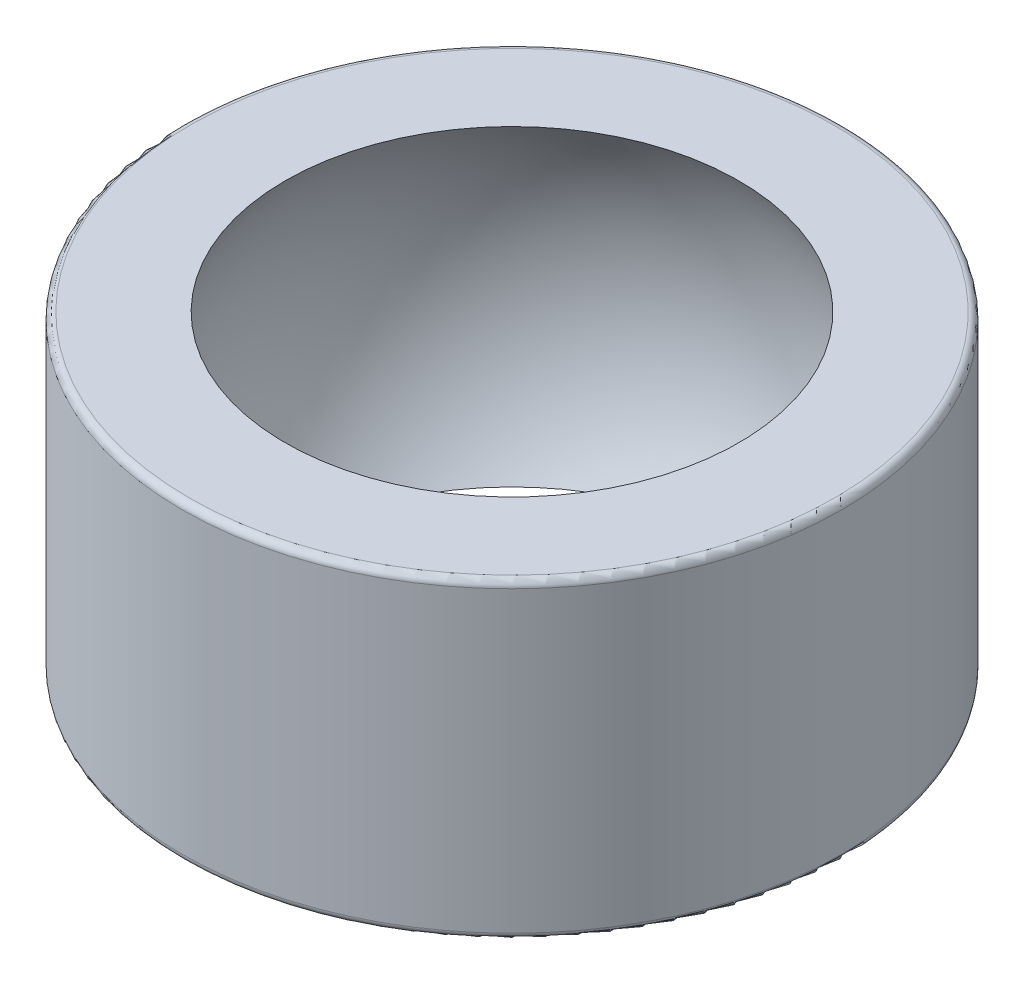
ISO-10303-21;
HEADER;
FILE_DESCRIPTION(('STEP AP214'),'2;1');
FILE_NAME('part.step','',(''),(''),'','','');
FILE_SCHEMA(('AUTOMOTIVE_DESIGN { 1 0 10303 214 1 1 1 1 }'));
ENDSEC;
DATA;
#1=APPLICATION_CONTEXT('core data for automotive mechanical design processes');
#2=APPLICATION_PROTOCOL_DEFINITION('international standard','automotive_design',2000,#1);
#3=PRODUCT_CONTEXT('',#1,'mechanical');
#4=PRODUCT('Part','Part','',(#3));
#5=PRODUCT_RELATED_PRODUCT_CATEGORY('part','',(#4));
#6=PRODUCT_DEFINITION_FORMATION('','',#4);
#7=PRODUCT_DEFINITION_CONTEXT('part definition',#1,'design');
#8=PRODUCT_DEFINITION('design','',#6,#7);
#9=PRODUCT_DEFINITION_SHAPE('','',#8);
#10=(LENGTH_UNIT() NAMED_UNIT(*) SI_UNIT(.MILLI.,.METRE.));
#11=(NAMED_UNIT(*) PLANE_ANGLE_UNIT() SI_UNIT($,.RADIAN.));
#12=(NAMED_UNIT(*) SI_UNIT($,.STERADIAN.) SOLID_ANGLE_UNIT());
#13=UNCERTAINTY_MEASURE_WITH_UNIT(LENGTH_MEASURE(1.E-05),#10,'distance_accuracy_value','');
#14=(GEOMETRIC_REPRESENTATION_CONTEXT(3) GLOBAL_UNCERTAINTY_ASSIGNED_CONTEXT((#13)) GLOBAL_UNIT_ASSIGNED_CONTEXT((#10,
#11,#12)) REPRESENTATION_CONTEXT('',''));
#15=CARTESIAN_POINT('',(0.,0.,0.));
#16=DIRECTION('',(0.,0.,1.));
#17=DIRECTION('',(1.,0.,0.));
#18=AXIS2_PLACEMENT_3D('',#15,#16,#17);
#19=CARTESIAN_POINT('',(0.,4.5,0.));
#20=DIRECTION('',(0.,-1.,0.));
#21=DIRECTION('',(0.,0.,-1.));
#22=AXIS2_PLACEMENT_3D('',#19,#20,#21);
#23=CYLINDRICAL_SURFACE('',#22,9.5);
#24=CARTESIAN_POINT('',(0.,-4.3,0.));
#25=DIRECTION('',(0.,1.,0.));
#26=DIRECTION('',(0.,0.,1.));
#27=AXIS2_PLACEMENT_3D('',#24,#25,#26);
#28=CIRCLE('',#27,9.5);
#29=CARTESIAN_POINT('',(0.,-4.3,9.5));
#30=VERTEX_POINT('',#29);
#31=EDGE_CURVE('E42',#30,#30,#28,.T.);
#32=ORIENTED_EDGE('',*,*,#31,.T.);
#33=EDGE_LOOP('',(#32));
#34=FACE_BOUND('',#33,.T.);
#35=CARTESIAN_POINT('',(0.,4.3,0.));
#36=DIRECTION('',(0.,1.,0.));
#37=DIRECTION('',(0.,0.,1.));
#38=AXIS2_PLACEMENT_3D('',#35,#36,#37);
#39=CIRCLE('',#38,9.5);
#40=CARTESIAN_POINT('',(0.,4.3,9.5));
#41=VERTEX_POINT('',#40);
#42=EDGE_CURVE('E46',#41,#41,#39,.F.);
#43=ORIENTED_EDGE('',*,*,#42,.T.);
#44=EDGE_LOOP('',(#43));
#45=FACE_BOUND('',#44,.T.);
#46=ADVANCED_FACE('F31',(#34,#45),#23,.T.);
#47=CARTESIAN_POINT('',(0.,4.5,0.));
#48=DIRECTION('',(0.,1.,0.));
#49=DIRECTION('',(0.,0.,1.));
#50=AXIS2_PLACEMENT_3D('',#47,#48,#49);
#51=PLANE('',#50);
#52=CARTESIAN_POINT('',(0.,4.5,0.));
#53=DIRECTION('',(0.,1.,0.));
#54=DIRECTION('',(0.,0.,1.));
#55=AXIS2_PLACEMENT_3D('',#52,#53,#54);
#56=CIRCLE('',#55,9.3);
#57=CARTESIAN_POINT('',(0.,4.5,9.3));
#58=VERTEX_POINT('',#57);
#59=EDGE_CURVE('E10',#58,#58,#56,.T.);
#60=ORIENTED_EDGE('',*,*,#59,.T.);
#61=EDGE_LOOP('',(#60));
#62=FACE_BOUND('',#61,.T.);
#63=CARTESIAN_POINT('',(0.,4.5,0.));
#64=DIRECTION('',(0.,1.,0.));
#65=DIRECTION('',(0.,0.,1.));
#66=AXIS2_PLACEMENT_3D('',#63,#64,#65);
#67=CIRCLE('',#66,6.54168174095928);
#68=CARTESIAN_POINT('',(-6.54168174095928,4.5,0.));
#69=VERTEX_POINT('',#68);
#70=EDGE_CURVE('E51',#69,#69,#67,.T.);
#71=ORIENTED_EDGE('',*,*,#70,.F.);
#72=EDGE_LOOP('',(#71));
#73=FACE_BOUND('',#72,.T.);
#74=ADVANCED_FACE('F61',(#62,#73),#51,.T.);
#75=CARTESIAN_POINT('',(0.,-4.5,0.));
#76=DIRECTION('',(0.,1.,0.));
#77=DIRECTION('',(0.,0.,1.));
#78=AXIS2_PLACEMENT_3D('',#75,#76,#77);
#79=PLANE('',#78);
#80=CARTESIAN_POINT('',(0.,-4.5,0.));
#81=DIRECTION('',(0.,1.,0.));
#82=DIRECTION('',(0.,0.,1.));
#83=AXIS2_PLACEMENT_3D('',#80,#81,#82);
#84=CIRCLE('',#83,9.3);
#85=CARTESIAN_POINT('',(0.,-4.5,9.3));
#86=VERTEX_POINT('',#85);
#87=EDGE_CURVE('E38',#86,#86,#84,.F.);
#88=ORIENTED_EDGE('',*,*,#87,.T.);
#89=EDGE_LOOP('',(#88));
#90=FACE_BOUND('',#89,.T.);
#91=CARTESIAN_POINT('',(0.,-4.5,0.));
#92=DIRECTION('',(0.,1.,0.));
#93=DIRECTION('',(0.,0.,1.));
#94=AXIS2_PLACEMENT_3D('',#91,#92,#93);
#95=CIRCLE('',#94,6.54168174095928);
#96=CARTESIAN_POINT('',(-6.54168174095928,-4.5,0.));
#97=VERTEX_POINT('',#96);
#98=EDGE_CURVE('E52',#97,#97,#95,.T.);
#99=ORIENTED_EDGE('',*,*,#98,.T.);
#100=EDGE_LOOP('',(#99));
#101=FACE_BOUND('',#100,.T.);
#102=ADVANCED_FACE('F63',(#90,#101),#79,.F.);
#103=CARTESIAN_POINT('',(0.,0.,0.));
#104=DIRECTION('',(0.,-1.,0.));
#105=DIRECTION('',(-1.,0.,0.));
#106=AXIS2_PLACEMENT_3D('',#103,#104,#105);
#107=SPHERICAL_SURFACE('',#106,7.94);
#108=CARTESIAN_POINT('',(-6.54168174095928,4.5,0.));
#109=CARTESIAN_POINT('',(-6.59817222339306,4.41788107267885,0.));
#110=CARTESIAN_POINT('',(-6.65311482442589,4.33469743881627,0.));
#111=CARTESIAN_POINT('',(-6.75982989556085,4.16632096715016,0.));
#112=CARTESIAN_POINT('',(-6.81160236566299,4.08112812934662,0.));
#113=CARTESIAN_POINT('',(-6.91190280680779,3.90885345894054,0.));
#114=CARTESIAN_POINT('',(-6.96043077785047,3.82177162633798,0.));
#115=CARTESIAN_POINT('',(-7.0541736583201,3.64584261769393,0.));
#116=CARTESIAN_POINT('',(-7.09938856774706,3.55699544165245,0.));
#117=CARTESIAN_POINT('',(-7.18644113788922,3.37766169634363,0.));
#118=CARTESIAN_POINT('',(-7.22827879860442,3.2871751270763,0.));
#119=CARTESIAN_POINT('',(-7.30851755995997,3.10469092515206,0.));
#120=CARTESIAN_POINT('',(-7.34691866060033,3.01269329249515,0.));
#121=CARTESIAN_POINT('',(-7.42022984062697,2.82731742176731,0.));
#122=CARTESIAN_POINT('',(-7.45513992001326,2.73393918369639,0.));
#123=CARTESIAN_POINT('',(-7.52141955315011,2.54593452187656,0.));
#124=CARTESIAN_POINT('',(-7.55278910690067,2.45130809812767,0.));
#125=CARTESIAN_POINT('',(-7.61194320351066,2.26094125367521,0.));
#126=CARTESIAN_POINT('',(-7.63972774637009,2.16520083297165,0.));
#127=CARTESIAN_POINT('',(-7.69167242026238,1.97274176336557,0.));
#128=CARTESIAN_POINT('',(-7.71583255129525,1.87602311446304,0.));
#129=CARTESIAN_POINT('',(-7.7604941402279,1.68174474435629,0.));
#130=CARTESIAN_POINT('',(-7.78099559812768,1.58418502315207,0.));
#131=CARTESIAN_POINT('',(-7.81831076785362,1.38836285707715,0.));
#132=CARTESIAN_POINT('',(-7.83512447967978,1.29010041220645,0.));
#133=CARTESIAN_POINT('',(-7.86504031387147,1.09301214395493,0.));
#134=CARTESIAN_POINT('',(-7.878142436237,0.994186320574125,0.));
#135=CARTESIAN_POINT('',(-7.90061651149694,0.796111439382618,0.));
#136=CARTESIAN_POINT('',(-7.90998846439135,0.696862381571921,0.));
#137=CARTESIAN_POINT('',(-7.9249889104203,0.498081775785703,0.));
#138=CARTESIAN_POINT('',(-7.93061740355484,0.398550227810182,0.));
#139=CARTESIAN_POINT('',(-7.93812294834469,0.19934578655644,0.));
#140=CARTESIAN_POINT('',(-7.94,0.0996728932782197,0.));
#141=CARTESIAN_POINT('',(-7.94,-0.0996728932782215,0.));
#142=CARTESIAN_POINT('',(-7.93812294834469,-0.199345786556442,0.));
#143=CARTESIAN_POINT('',(-7.93061740355484,-0.398550227810184,0.));
#144=CARTESIAN_POINT('',(-7.9249889104203,-0.498081775785705,0.));
#145=CARTESIAN_POINT('',(-7.90998846439135,-0.696862381571923,0.));
#146=CARTESIAN_POINT('',(-7.90061651149694,-0.79611143938262,0.));
#147=CARTESIAN_POINT('',(-7.878142436237,-0.994186320574126,0.));
#148=CARTESIAN_POINT('',(-7.86504031387147,-1.09301214395494,0.));
#149=CARTESIAN_POINT('',(-7.83512447967978,-1.29010041220645,0.));
#150=CARTESIAN_POINT('',(-7.81831076785362,-1.38836285707715,0.));
#151=CARTESIAN_POINT('',(-7.78099559812768,-1.58418502315207,0.));
#152=CARTESIAN_POINT('',(-7.7604941402279,-1.68174474435629,0.));
#153=CARTESIAN_POINT('',(-7.71583255129525,-1.87602311446304,0.));
#154=CARTESIAN_POINT('',(-7.69167242026238,-1.97274176336557,0.));
#155=CARTESIAN_POINT('',(-7.63972774637008,-2.16520083297165,0.));
#156=CARTESIAN_POINT('',(-7.61194320351066,-2.26094125367521,0.));
#157=CARTESIAN_POINT('',(-7.55278910690067,-2.45130809812767,0.));
#158=CARTESIAN_POINT('',(-7.52141955315011,-2.54593452187657,0.));
#159=CARTESIAN_POINT('',(-7.45513992001326,-2.73393918369639,0.));
#160=CARTESIAN_POINT('',(-7.42022984062697,-2.82731742176732,0.));
#161=CARTESIAN_POINT('',(-7.34691866060033,-3.01269329249515,0.));
#162=CARTESIAN_POINT('',(-7.30851755995997,-3.10469092515206,0.));
#163=CARTESIAN_POINT('',(-7.22827879860442,-3.2871751270763,0.));
#164=CARTESIAN_POINT('',(-7.18644113788922,-3.37766169634363,0.));
#165=CARTESIAN_POINT('',(-7.09938856774706,-3.55699544165245,0.));
#166=CARTESIAN_POINT('',(-7.0541736583201,-3.64584261769393,0.));
#167=CARTESIAN_POINT('',(-6.96043077785047,-3.82177162633798,0.));
#168=CARTESIAN_POINT('',(-6.91190280680779,-3.90885345894054,0.));
#169=CARTESIAN_POINT('',(-6.81160236566298,-4.08112812934663,0.));
#170=CARTESIAN_POINT('',(-6.75982989556085,-4.16632096715016,0.));
#171=CARTESIAN_POINT('',(-6.65311482442589,-4.33469743881627,0.));
#172=CARTESIAN_POINT('',(-6.59817222339306,-4.41788107267885,0.));
#173=CARTESIAN_POINT('',(-6.54168174095928,-4.5,0.));
#174=B_SPLINE_CURVE_WITH_KNOTS('',3,(#108,#109,#110,#111,#112,#113,#114,#115,#116,#117,#118,
#119,#120,#121,#122,#123,#124,#125,#126,#127,#128,#129,#130,#131,#132,#133,#134,#135,#136,#137,
#138,#139,#140,#141,#142,#143,#144,#145,#146,#147,#148,#149,#150,#151,#152,#153,#154,#155,#156,
#157,#158,#159,#160,#161,#162,#163,#164,#165,#166,#167,#168,#169,#170,#171,#172,#173),
.UNSPECIFIED.,.F.,.F.,(4,2,2,2,2,2,2,2,2,2,2,2,2,2,2,2,2,2,2,2,2,2,2,2,2,2,2,2,2,2,2,2,4),(0.,
0.299001013238602,0.598002026477203,0.897003039715804,1.19600405295441,1.49500506619301,
1.79400607943161,2.09300709267021,2.39200810590881,2.69100911914741,2.99001013238601,
3.28901114562462,3.58801215886322,3.88701317210182,4.18601418534042,4.48501519857902,
4.78401621181762,5.08301722505622,5.38201823829483,5.68101925153343,5.98002026477203,
6.27902127801063,6.57802229124923,6.87702330448783,7.17602431772643,7.47502533096504,
7.77402634420364,8.07302735744224,8.37202837068084,8.67102938391944,8.97003039715804,
9.26903141039664,9.56803242363524),.UNSPECIFIED.);
#175=EDGE_CURVE('BSEAM58',#69,#97,#174,.T.);
#176=ORIENTED_EDGE('',*,*,#70,.T.);
#177=ORIENTED_EDGE('',*,*,#98,.F.);
#178=ORIENTED_EDGE('',*,*,#175,.T.);
#179=ORIENTED_EDGE('',*,*,#175,.F.);
#180=EDGE_LOOP('',(#176,#178,#177,#179));
#181=FACE_BOUND('',#180,.T.);
#182=ADVANCED_FACE('F58',(#181),#107,.F.);
#183=CARTESIAN_POINT('',(0.,-4.3,0.));
#184=DIRECTION('',(0.,1.,0.));
#185=DIRECTION('',(0.,0.,1.));
#186=AXIS2_PLACEMENT_3D('',#183,#184,#185);
#187=TOROIDAL_SURFACE('',#186,9.3,0.2);
#188=ORIENTED_EDGE('',*,*,#87,.F.);
#189=EDGE_LOOP('',(#188));
#190=FACE_BOUND('',#189,.T.);
#191=ORIENTED_EDGE('',*,*,#31,.F.);
#192=EDGE_LOOP('',(#191));
#193=FACE_BOUND('',#192,.T.);
#194=ADVANCED_FACE('F73',(#190,#193),#187,.T.);
#195=CARTESIAN_POINT('',(0.,4.3,0.));
#196=DIRECTION('',(0.,1.,0.));
#197=DIRECTION('',(0.,0.,1.));
#198=AXIS2_PLACEMENT_3D('',#195,#196,#197);
#199=TOROIDAL_SURFACE('',#198,9.3,0.2);
#200=ORIENTED_EDGE('',*,*,#42,.F.);
#201=EDGE_LOOP('',(#200));
#202=FACE_BOUND('',#201,.T.);
#203=ORIENTED_EDGE('',*,*,#59,.F.);
#204=EDGE_LOOP('',(#203));
#205=FACE_BOUND('',#204,.T.);
#206=ADVANCED_FACE('F33',(#202,#205),#199,.T.);
#207=CLOSED_SHELL('',(#46,#74,#102,#182,#194,#206));
#208=MANIFOLD_SOLID_BREP('B2',#207);
#209=ADVANCED_BREP_SHAPE_REPRESENTATION('',(#18,#208),#14);
#210=SHAPE_DEFINITION_REPRESENTATION(#9,#209);
ENDSEC;
END-ISO-10303-21;
